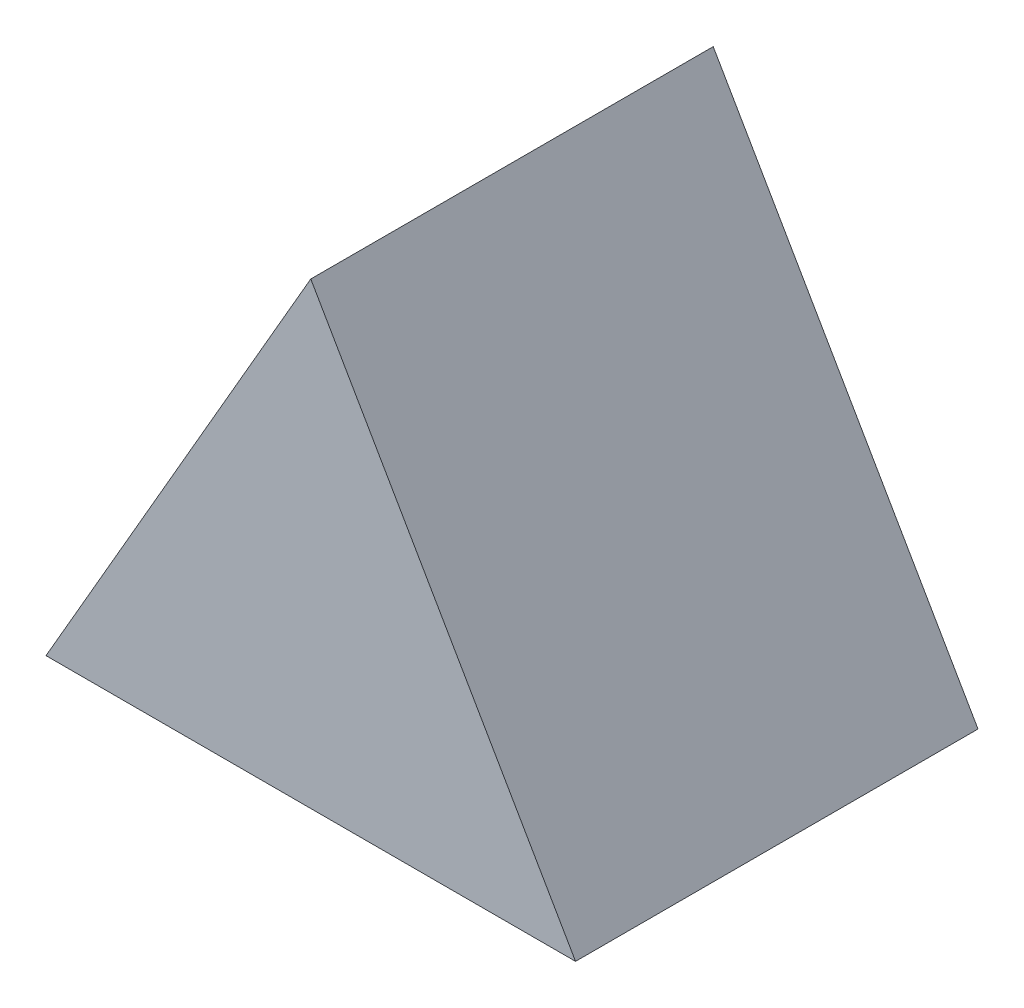
ISO-10303-21;
HEADER;
FILE_DESCRIPTION(('STEP AP214'),'2;1');
FILE_NAME('part.step','',(''),(''),'','','');
FILE_SCHEMA(('AUTOMOTIVE_DESIGN { 1 0 10303 214 1 1 1 1 }'));
ENDSEC;
DATA;
#1=APPLICATION_CONTEXT('core data for automotive mechanical design processes');
#2=APPLICATION_PROTOCOL_DEFINITION('international standard','automotive_design',2000,#1);
#3=PRODUCT_CONTEXT('',#1,'mechanical');
#4=PRODUCT('Part','Part','',(#3));
#5=PRODUCT_RELATED_PRODUCT_CATEGORY('part','',(#4));
#6=PRODUCT_DEFINITION_FORMATION('','',#4);
#7=PRODUCT_DEFINITION_CONTEXT('part definition',#1,'design');
#8=PRODUCT_DEFINITION('design','',#6,#7);
#9=PRODUCT_DEFINITION_SHAPE('','',#8);
#10=(LENGTH_UNIT() NAMED_UNIT(*) SI_UNIT(.MILLI.,.METRE.));
#11=(NAMED_UNIT(*) PLANE_ANGLE_UNIT() SI_UNIT($,.RADIAN.));
#12=(NAMED_UNIT(*) SI_UNIT($,.STERADIAN.) SOLID_ANGLE_UNIT());
#13=UNCERTAINTY_MEASURE_WITH_UNIT(LENGTH_MEASURE(1.E-05),#10,'distance_accuracy_value','');
#14=(GEOMETRIC_REPRESENTATION_CONTEXT(3) GLOBAL_UNCERTAINTY_ASSIGNED_CONTEXT((#13)) GLOBAL_UNIT_ASSIGNED_CONTEXT((#10,
#11,#12)) REPRESENTATION_CONTEXT('',''));
#15=CARTESIAN_POINT('',(0.,0.,0.));
#16=DIRECTION('',(0.,0.,1.));
#17=DIRECTION('',(1.,0.,0.));
#18=AXIS2_PLACEMENT_3D('',#15,#16,#17);
#19=CARTESIAN_POINT('',(2.49999999999999,-2.26506350946109,3.8));
#20=DIRECTION('',(0.,1.,0.));
#21=DIRECTION('',(0.,0.,1.));
#22=AXIS2_PLACEMENT_3D('',#19,#20,#21);
#23=PLANE('',#22);
#24=DIRECTION('',(1.,0.,0.));
#25=VECTOR('',#24,1.);
#26=CARTESIAN_POINT('',(2.49999999999999,-2.26506350946109,0.));
#27=LINE('',#26,#25);
#28=CARTESIAN_POINT('',(-2.49999999999999,-2.26506350946109,0.));
#29=VERTEX_POINT('',#28);
#30=CARTESIAN_POINT('',(2.49999999999999,-2.26506350946109,0.));
#31=VERTEX_POINT('',#30);
#32=EDGE_CURVE('E85',#29,#31,#27,.T.);
#33=ORIENTED_EDGE('',*,*,#32,.T.);
#34=DIRECTION('',(0.,0.,-1.));
#35=VECTOR('',#34,1.);
#36=CARTESIAN_POINT('',(2.49999999999999,-2.26506350946109,3.8));
#37=LINE('',#36,#35);
#38=CARTESIAN_POINT('',(2.49999999999999,-2.26506350946109,3.8));
#39=VERTEX_POINT('',#38);
#40=EDGE_CURVE('E11',#39,#31,#37,.T.);
#41=ORIENTED_EDGE('',*,*,#40,.F.);
#42=DIRECTION('',(1.,0.,0.));
#43=VECTOR('',#42,1.);
#44=CARTESIAN_POINT('',(2.49999999999999,-2.26506350946109,3.8));
#45=LINE('',#44,#43);
#46=CARTESIAN_POINT('',(-2.49999999999999,-2.26506350946109,3.8));
#47=VERTEX_POINT('',#46);
#48=EDGE_CURVE('E78',#47,#39,#45,.T.);
#49=ORIENTED_EDGE('',*,*,#48,.F.);
#50=DIRECTION('',(0.,0.,-1.));
#51=VECTOR('',#50,1.);
#52=CARTESIAN_POINT('',(-2.49999999999999,-2.26506350946109,3.8));
#53=LINE('',#52,#51);
#54=EDGE_CURVE('E86',#47,#29,#53,.T.);
#55=ORIENTED_EDGE('',*,*,#54,.T.);
#56=EDGE_LOOP('',(#33,#41,#49,#55));
#57=FACE_BOUND('',#56,.T.);
#58=ADVANCED_FACE('F38',(#57),#23,.F.);
#59=CARTESIAN_POINT('',(0.,2.06506350946109,3.8));
#60=DIRECTION('',(-0.866025403784439,-0.5,0.));
#61=DIRECTION('',(0.5,-0.866025403784439,0.));
#62=AXIS2_PLACEMENT_3D('',#59,#60,#61);
#63=PLANE('',#62);
#64=DIRECTION('',(-0.5,0.866025403784439,0.));
#65=VECTOR('',#64,1.);
#66=CARTESIAN_POINT('',(0.,2.06506350946109,0.));
#67=LINE('',#66,#65);
#68=CARTESIAN_POINT('',(0.,2.06506350946109,0.));
#69=VERTEX_POINT('',#68);
#70=EDGE_CURVE('E66',#31,#69,#67,.T.);
#71=ORIENTED_EDGE('',*,*,#70,.T.);
#72=DIRECTION('',(0.,0.,-1.));
#73=VECTOR('',#72,1.);
#74=CARTESIAN_POINT('',(0.,2.06506350946109,3.8));
#75=LINE('',#74,#73);
#76=CARTESIAN_POINT('',(0.,2.06506350946109,3.8));
#77=VERTEX_POINT('',#76);
#78=EDGE_CURVE('E46',#77,#69,#75,.T.);
#79=ORIENTED_EDGE('',*,*,#78,.F.);
#80=DIRECTION('',(-0.5,0.866025403784439,0.));
#81=VECTOR('',#80,1.);
#82=CARTESIAN_POINT('',(0.,2.06506350946109,3.8));
#83=LINE('',#82,#81);
#84=EDGE_CURVE('E74',#39,#77,#83,.T.);
#85=ORIENTED_EDGE('',*,*,#84,.F.);
#86=ORIENTED_EDGE('',*,*,#40,.T.);
#87=EDGE_LOOP('',(#71,#79,#85,#86));
#88=FACE_BOUND('',#87,.T.);
#89=ADVANCED_FACE('F75',(#88),#63,.F.);
#90=CARTESIAN_POINT('',(-2.49999999999999,-2.26506350946109,3.8));
#91=DIRECTION('',(0.866025403784439,-0.5,0.));
#92=DIRECTION('',(0.5,0.866025403784439,0.));
#93=AXIS2_PLACEMENT_3D('',#90,#91,#92);
#94=PLANE('',#93);
#95=DIRECTION('',(-0.5,-0.866025403784439,0.));
#96=VECTOR('',#95,1.);
#97=CARTESIAN_POINT('',(-2.49999999999999,-2.26506350946109,0.));
#98=LINE('',#97,#96);
#99=EDGE_CURVE('E71',#69,#29,#98,.T.);
#100=ORIENTED_EDGE('',*,*,#99,.T.);
#101=ORIENTED_EDGE('',*,*,#54,.F.);
#102=DIRECTION('',(-0.5,-0.866025403784439,0.));
#103=VECTOR('',#102,1.);
#104=CARTESIAN_POINT('',(-2.49999999999999,-2.26506350946109,3.8));
#105=LINE('',#104,#103);
#106=EDGE_CURVE('E54',#77,#47,#105,.T.);
#107=ORIENTED_EDGE('',*,*,#106,.F.);
#108=ORIENTED_EDGE('',*,*,#78,.T.);
#109=EDGE_LOOP('',(#100,#101,#107,#108));
#110=FACE_BOUND('',#109,.T.);
#111=ADVANCED_FACE('F93',(#110),#94,.F.);
#112=CARTESIAN_POINT('',(0.,0.,3.8));
#113=DIRECTION('',(0.,0.,-1.));
#114=DIRECTION('',(-1.,0.,0.));
#115=AXIS2_PLACEMENT_3D('',#112,#113,#114);
#116=PLANE('',#115);
#117=ORIENTED_EDGE('',*,*,#48,.T.);
#118=ORIENTED_EDGE('',*,*,#84,.T.);
#119=ORIENTED_EDGE('',*,*,#106,.T.);
#120=EDGE_LOOP('',(#117,#118,#119));
#121=FACE_BOUND('',#120,.T.);
#122=ADVANCED_FACE('F81',(#121),#116,.F.);
#123=CARTESIAN_POINT('',(0.,0.,0.));
#124=DIRECTION('',(0.,0.,-1.));
#125=DIRECTION('',(-1.,0.,0.));
#126=AXIS2_PLACEMENT_3D('',#123,#124,#125);
#127=PLANE('',#126);
#128=ORIENTED_EDGE('',*,*,#32,.F.);
#129=ORIENTED_EDGE('',*,*,#99,.F.);
#130=ORIENTED_EDGE('',*,*,#70,.F.);
#131=EDGE_LOOP('',(#128,#129,#130));
#132=FACE_BOUND('',#131,.T.);
#133=ADVANCED_FACE('F94',(#132),#127,.T.);
#134=CLOSED_SHELL('',(#58,#89,#111,#122,#133));
#135=MANIFOLD_SOLID_BREP('B2',#134);
#136=ADVANCED_BREP_SHAPE_REPRESENTATION('',(#18,#135),#14);
#137=SHAPE_DEFINITION_REPRESENTATION(#9,#136);
ENDSEC;
END-ISO-10303-21;
